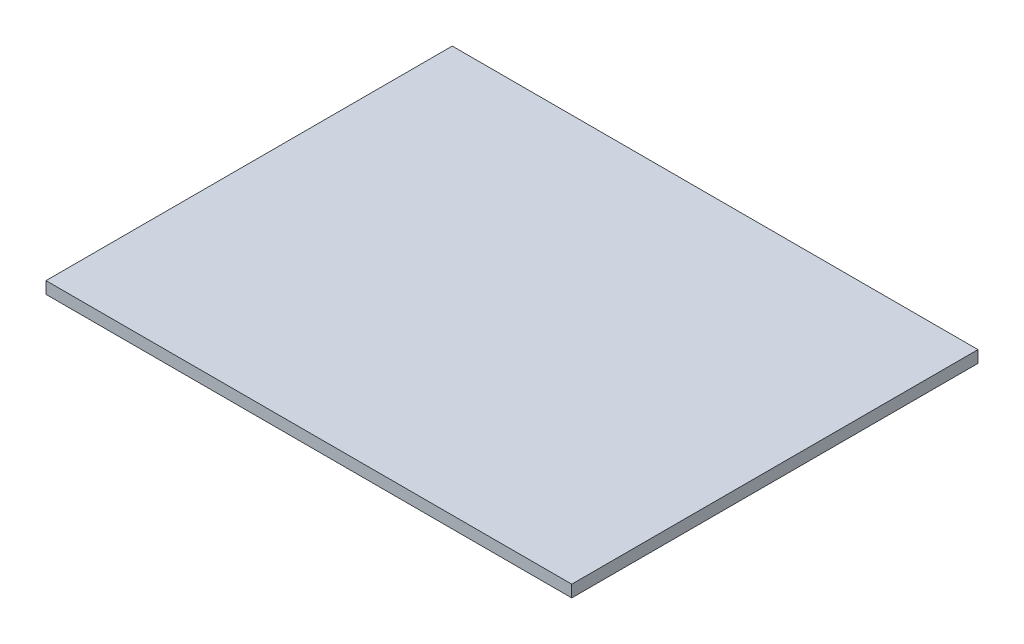
ISO-10303-21;
HEADER;
FILE_DESCRIPTION(('STEP AP214'),'2;1');
FILE_NAME('part.step','',(''),(''),'','','');
FILE_SCHEMA(('AUTOMOTIVE_DESIGN { 1 0 10303 214 1 1 1 1 }'));
ENDSEC;
DATA;
#1=APPLICATION_CONTEXT('core data for automotive mechanical design processes');
#2=APPLICATION_PROTOCOL_DEFINITION('international standard','automotive_design',2000,#1);
#3=PRODUCT_CONTEXT('',#1,'mechanical');
#4=PRODUCT('Part','Part','',(#3));
#5=PRODUCT_RELATED_PRODUCT_CATEGORY('part','',(#4));
#6=PRODUCT_DEFINITION_FORMATION('','',#4);
#7=PRODUCT_DEFINITION_CONTEXT('part definition',#1,'design');
#8=PRODUCT_DEFINITION('design','',#6,#7);
#9=PRODUCT_DEFINITION_SHAPE('','',#8);
#10=(LENGTH_UNIT() NAMED_UNIT(*) SI_UNIT(.MILLI.,.METRE.));
#11=(NAMED_UNIT(*) PLANE_ANGLE_UNIT() SI_UNIT($,.RADIAN.));
#12=(NAMED_UNIT(*) SI_UNIT($,.STERADIAN.) SOLID_ANGLE_UNIT());
#13=UNCERTAINTY_MEASURE_WITH_UNIT(LENGTH_MEASURE(1.E-05),#10,'distance_accuracy_value','');
#14=(GEOMETRIC_REPRESENTATION_CONTEXT(3) GLOBAL_UNCERTAINTY_ASSIGNED_CONTEXT((#13)) GLOBAL_UNIT_ASSIGNED_CONTEXT((#10,
#11,#12)) REPRESENTATION_CONTEXT('',''));
#15=CARTESIAN_POINT('',(0.,0.,0.));
#16=DIRECTION('',(0.,0.,1.));
#17=DIRECTION('',(1.,0.,0.));
#18=AXIS2_PLACEMENT_3D('',#15,#16,#17);
#19=CARTESIAN_POINT('',(139.7,6.35,107.95));
#20=DIRECTION('',(-1.,0.,0.));
#21=DIRECTION('',(0.,0.,1.));
#22=AXIS2_PLACEMENT_3D('',#19,#20,#21);
#23=PLANE('',#22);
#24=DIRECTION('',(0.,0.,-1.));
#25=VECTOR('',#24,1.);
#26=CARTESIAN_POINT('',(139.7,0.,107.95));
#27=LINE('',#26,#25);
#28=CARTESIAN_POINT('',(139.7,0.,107.95));
#29=VERTEX_POINT('',#28);
#30=CARTESIAN_POINT('',(139.7,0.,-107.95));
#31=VERTEX_POINT('',#30);
#32=EDGE_CURVE('E111',#29,#31,#27,.T.);
#33=ORIENTED_EDGE('',*,*,#32,.T.);
#34=DIRECTION('',(0.,-1.,0.));
#35=VECTOR('',#34,1.);
#36=CARTESIAN_POINT('',(139.7,6.35,-107.95));
#37=LINE('',#36,#35);
#38=CARTESIAN_POINT('',(139.7,6.35,-107.95));
#39=VERTEX_POINT('',#38);
#40=EDGE_CURVE('E11',#39,#31,#37,.T.);
#41=ORIENTED_EDGE('',*,*,#40,.F.);
#42=DIRECTION('',(0.,0.,-1.));
#43=VECTOR('',#42,1.);
#44=CARTESIAN_POINT('',(139.7,6.35,107.95));
#45=LINE('',#44,#43);
#46=CARTESIAN_POINT('',(139.7,6.35,107.95));
#47=VERTEX_POINT('',#46);
#48=EDGE_CURVE('E95',#47,#39,#45,.T.);
#49=ORIENTED_EDGE('',*,*,#48,.F.);
#50=DIRECTION('',(0.,-1.,0.));
#51=VECTOR('',#50,1.);
#52=CARTESIAN_POINT('',(139.7,6.35,107.95));
#53=LINE('',#52,#51);
#54=EDGE_CURVE('E107',#47,#29,#53,.T.);
#55=ORIENTED_EDGE('',*,*,#54,.T.);
#56=EDGE_LOOP('',(#33,#41,#49,#55));
#57=FACE_BOUND('',#56,.T.);
#58=ADVANCED_FACE('F43',(#57),#23,.F.);
#59=CARTESIAN_POINT('',(-139.7,6.35,-107.95));
#60=DIRECTION('',(0.,0.,1.));
#61=DIRECTION('',(1.,0.,0.));
#62=AXIS2_PLACEMENT_3D('',#59,#60,#61);
#63=PLANE('',#62);
#64=DIRECTION('',(-1.,0.,0.));
#65=VECTOR('',#64,1.);
#66=CARTESIAN_POINT('',(-139.7,0.,-107.95));
#67=LINE('',#66,#65);
#68=CARTESIAN_POINT('',(-139.7,0.,-107.95));
#69=VERTEX_POINT('',#68);
#70=EDGE_CURVE('E100',#31,#69,#67,.T.);
#71=ORIENTED_EDGE('',*,*,#70,.T.);
#72=DIRECTION('',(0.,-1.,0.));
#73=VECTOR('',#72,1.);
#74=CARTESIAN_POINT('',(-139.7,6.35,-107.95));
#75=LINE('',#74,#73);
#76=CARTESIAN_POINT('',(-139.7,6.35,-107.95));
#77=VERTEX_POINT('',#76);
#78=EDGE_CURVE('E52',#77,#69,#75,.T.);
#79=ORIENTED_EDGE('',*,*,#78,.F.);
#80=DIRECTION('',(-1.,0.,0.));
#81=VECTOR('',#80,1.);
#82=CARTESIAN_POINT('',(-139.7,6.35,-107.95));
#83=LINE('',#82,#81);
#84=EDGE_CURVE('E90',#39,#77,#83,.T.);
#85=ORIENTED_EDGE('',*,*,#84,.F.);
#86=ORIENTED_EDGE('',*,*,#40,.T.);
#87=EDGE_LOOP('',(#71,#79,#85,#86));
#88=FACE_BOUND('',#87,.T.);
#89=ADVANCED_FACE('F99',(#88),#63,.F.);
#90=CARTESIAN_POINT('',(-139.7,6.35,107.95));
#91=DIRECTION('',(1.,0.,0.));
#92=DIRECTION('',(0.,0.,-1.));
#93=AXIS2_PLACEMENT_3D('',#90,#91,#92);
#94=PLANE('',#93);
#95=DIRECTION('',(0.,0.,1.));
#96=VECTOR('',#95,1.);
#97=CARTESIAN_POINT('',(-139.7,0.,107.95));
#98=LINE('',#97,#96);
#99=CARTESIAN_POINT('',(-139.7,0.,107.95));
#100=VERTEX_POINT('',#99);
#101=EDGE_CURVE('E77',#69,#100,#98,.T.);
#102=ORIENTED_EDGE('',*,*,#101,.T.);
#103=DIRECTION('',(0.,-1.,0.));
#104=VECTOR('',#103,1.);
#105=CARTESIAN_POINT('',(-139.7,6.35,107.95));
#106=LINE('',#105,#104);
#107=CARTESIAN_POINT('',(-139.7,6.35,107.95));
#108=VERTEX_POINT('',#107);
#109=EDGE_CURVE('E102',#108,#100,#106,.T.);
#110=ORIENTED_EDGE('',*,*,#109,.F.);
#111=DIRECTION('',(0.,0.,1.));
#112=VECTOR('',#111,1.);
#113=CARTESIAN_POINT('',(-139.7,6.35,107.95));
#114=LINE('',#113,#112);
#115=EDGE_CURVE('E93',#77,#108,#114,.T.);
#116=ORIENTED_EDGE('',*,*,#115,.F.);
#117=ORIENTED_EDGE('',*,*,#78,.T.);
#118=EDGE_LOOP('',(#102,#110,#116,#117));
#119=FACE_BOUND('',#118,.T.);
#120=ADVANCED_FACE('F103',(#119),#94,.F.);
#121=CARTESIAN_POINT('',(-139.7,6.35,107.95));
#122=DIRECTION('',(0.,0.,-1.));
#123=DIRECTION('',(-1.,0.,0.));
#124=AXIS2_PLACEMENT_3D('',#121,#122,#123);
#125=PLANE('',#124);
#126=DIRECTION('',(1.,0.,0.));
#127=VECTOR('',#126,1.);
#128=CARTESIAN_POINT('',(-139.7,0.,107.95));
#129=LINE('',#128,#127);
#130=EDGE_CURVE('E83',#100,#29,#129,.T.);
#131=ORIENTED_EDGE('',*,*,#130,.T.);
#132=ORIENTED_EDGE('',*,*,#54,.F.);
#133=DIRECTION('',(1.,0.,0.));
#134=VECTOR('',#133,1.);
#135=CARTESIAN_POINT('',(-139.7,6.35,107.95));
#136=LINE('',#135,#134);
#137=EDGE_CURVE('E60',#108,#47,#136,.T.);
#138=ORIENTED_EDGE('',*,*,#137,.F.);
#139=ORIENTED_EDGE('',*,*,#109,.T.);
#140=EDGE_LOOP('',(#131,#132,#138,#139));
#141=FACE_BOUND('',#140,.T.);
#142=ADVANCED_FACE('F124',(#141),#125,.F.);
#143=CARTESIAN_POINT('',(0.,6.35,0.));
#144=DIRECTION('',(0.,-1.,0.));
#145=DIRECTION('',(0.,0.,-1.));
#146=AXIS2_PLACEMENT_3D('',#143,#144,#145);
#147=PLANE('',#146);
#148=ORIENTED_EDGE('',*,*,#48,.T.);
#149=ORIENTED_EDGE('',*,*,#84,.T.);
#150=ORIENTED_EDGE('',*,*,#115,.T.);
#151=ORIENTED_EDGE('',*,*,#137,.T.);
#152=EDGE_LOOP('',(#148,#149,#150,#151));
#153=FACE_BOUND('',#152,.T.);
#154=ADVANCED_FACE('F91',(#153),#147,.F.);
#155=CARTESIAN_POINT('',(0.,0.,0.));
#156=DIRECTION('',(0.,-1.,0.));
#157=DIRECTION('',(0.,0.,-1.));
#158=AXIS2_PLACEMENT_3D('',#155,#156,#157);
#159=PLANE('',#158);
#160=ORIENTED_EDGE('',*,*,#32,.F.);
#161=ORIENTED_EDGE('',*,*,#130,.F.);
#162=ORIENTED_EDGE('',*,*,#101,.F.);
#163=ORIENTED_EDGE('',*,*,#70,.F.);
#164=EDGE_LOOP('',(#160,#161,#162,#163));
#165=FACE_BOUND('',#164,.T.);
#166=ADVANCED_FACE('F127',(#165),#159,.T.);
#167=CLOSED_SHELL('',(#58,#89,#120,#142,#154,#166));
#168=MANIFOLD_SOLID_BREP('B2',#167);
#169=ADVANCED_BREP_SHAPE_REPRESENTATION('',(#18,#168),#14);
#170=SHAPE_DEFINITION_REPRESENTATION(#9,#169);
ENDSEC;
END-ISO-10303-21;
